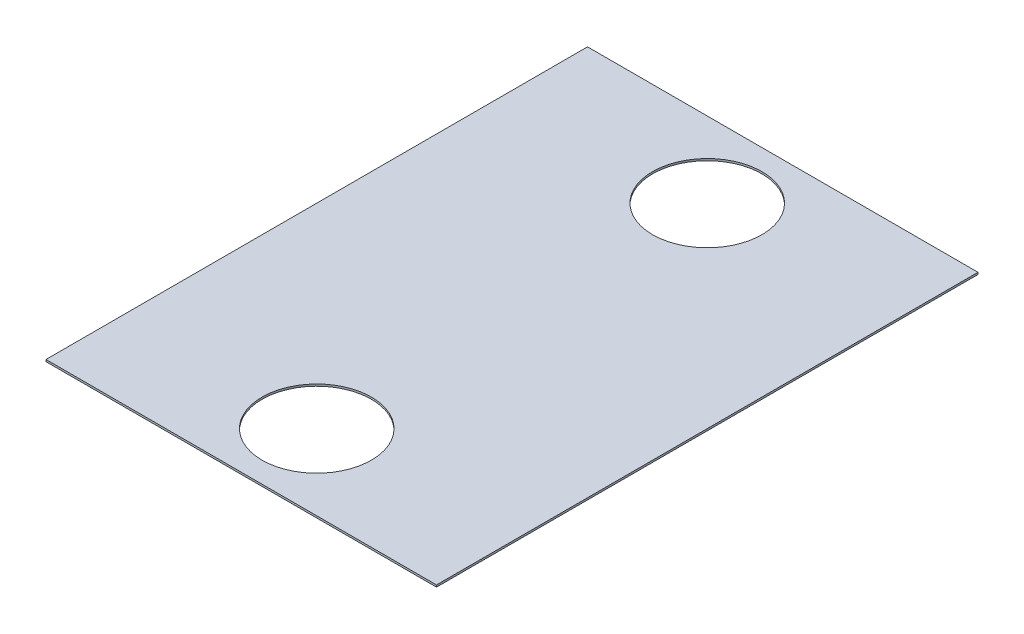
ISO-10303-21;
HEADER;
FILE_DESCRIPTION(('STEP AP214'),'2;1');
FILE_NAME('part.step','',(''),(''),'','','');
FILE_SCHEMA(('AUTOMOTIVE_DESIGN { 1 0 10303 214 1 1 1 1 }'));
ENDSEC;
DATA;
#1=APPLICATION_CONTEXT('core data for automotive mechanical design processes');
#2=APPLICATION_PROTOCOL_DEFINITION('international standard','automotive_design',2000,#1);
#3=PRODUCT_CONTEXT('',#1,'mechanical');
#4=PRODUCT('Part','Part','',(#3));
#5=PRODUCT_RELATED_PRODUCT_CATEGORY('part','',(#4));
#6=PRODUCT_DEFINITION_FORMATION('','',#4);
#7=PRODUCT_DEFINITION_CONTEXT('part definition',#1,'design');
#8=PRODUCT_DEFINITION('design','',#6,#7);
#9=PRODUCT_DEFINITION_SHAPE('','',#8);
#10=(LENGTH_UNIT() NAMED_UNIT(*) SI_UNIT(.MILLI.,.METRE.));
#11=(NAMED_UNIT(*) PLANE_ANGLE_UNIT() SI_UNIT($,.RADIAN.));
#12=(NAMED_UNIT(*) SI_UNIT($,.STERADIAN.) SOLID_ANGLE_UNIT());
#13=UNCERTAINTY_MEASURE_WITH_UNIT(LENGTH_MEASURE(1.E-05),#10,'distance_accuracy_value','');
#14=(GEOMETRIC_REPRESENTATION_CONTEXT(3) GLOBAL_UNCERTAINTY_ASSIGNED_CONTEXT((#13)) GLOBAL_UNIT_ASSIGNED_CONTEXT((#10,
#11,#12)) REPRESENTATION_CONTEXT('',''));
#15=CARTESIAN_POINT('',(0.,0.,0.));
#16=DIRECTION('',(0.,0.,1.));
#17=DIRECTION('',(1.,0.,0.));
#18=AXIS2_PLACEMENT_3D('',#15,#16,#17);
#19=CARTESIAN_POINT('',(-150.,1.5,-208.));
#20=DIRECTION('',(1.,0.,0.));
#21=DIRECTION('',(0.,0.,-1.));
#22=AXIS2_PLACEMENT_3D('',#19,#20,#21);
#23=PLANE('',#22);
#24=DIRECTION('',(0.,0.,1.));
#25=VECTOR('',#24,1.);
#26=CARTESIAN_POINT('',(-150.,0.,-208.));
#27=LINE('',#26,#25);
#28=CARTESIAN_POINT('',(-150.,0.,-208.));
#29=VERTEX_POINT('',#28);
#30=CARTESIAN_POINT('',(-150.,0.,208.));
#31=VERTEX_POINT('',#30);
#32=EDGE_CURVE('E106',#29,#31,#27,.T.);
#33=ORIENTED_EDGE('',*,*,#32,.T.);
#34=DIRECTION('',(0.,-1.,0.));
#35=VECTOR('',#34,1.);
#36=CARTESIAN_POINT('',(-150.,1.5,208.));
#37=LINE('',#36,#35);
#38=CARTESIAN_POINT('',(-150.,1.5,208.));
#39=VERTEX_POINT('',#38);
#40=EDGE_CURVE('E11',#39,#31,#37,.T.);
#41=ORIENTED_EDGE('',*,*,#40,.F.);
#42=DIRECTION('',(0.,0.,1.));
#43=VECTOR('',#42,1.);
#44=CARTESIAN_POINT('',(-150.,1.5,-208.));
#45=LINE('',#44,#43);
#46=CARTESIAN_POINT('',(-150.,1.5,-208.));
#47=VERTEX_POINT('',#46);
#48=EDGE_CURVE('E94',#47,#39,#45,.T.);
#49=ORIENTED_EDGE('',*,*,#48,.F.);
#50=DIRECTION('',(0.,-1.,0.));
#51=VECTOR('',#50,1.);
#52=CARTESIAN_POINT('',(-150.,1.5,-208.));
#53=LINE('',#52,#51);
#54=EDGE_CURVE('E105',#47,#29,#53,.T.);
#55=ORIENTED_EDGE('',*,*,#54,.T.);
#56=EDGE_LOOP('',(#33,#41,#49,#55));
#57=FACE_BOUND('',#56,.T.);
#58=ADVANCED_FACE('F43',(#57),#23,.F.);
#59=CARTESIAN_POINT('',(-150.,1.5,208.));
#60=DIRECTION('',(0.,0.,-1.));
#61=DIRECTION('',(-1.,0.,0.));
#62=AXIS2_PLACEMENT_3D('',#59,#60,#61);
#63=PLANE('',#62);
#64=DIRECTION('',(1.,0.,0.));
#65=VECTOR('',#64,1.);
#66=CARTESIAN_POINT('',(-150.,0.,208.));
#67=LINE('',#66,#65);
#68=CARTESIAN_POINT('',(150.,0.,208.));
#69=VERTEX_POINT('',#68);
#70=EDGE_CURVE('E98',#31,#69,#67,.T.);
#71=ORIENTED_EDGE('',*,*,#70,.T.);
#72=DIRECTION('',(0.,-1.,0.));
#73=VECTOR('',#72,1.);
#74=CARTESIAN_POINT('',(150.,1.5,208.));
#75=LINE('',#74,#73);
#76=CARTESIAN_POINT('',(150.,1.5,208.));
#77=VERTEX_POINT('',#76);
#78=EDGE_CURVE('E51',#77,#69,#75,.T.);
#79=ORIENTED_EDGE('',*,*,#78,.F.);
#80=DIRECTION('',(1.,0.,0.));
#81=VECTOR('',#80,1.);
#82=CARTESIAN_POINT('',(-150.,1.5,208.));
#83=LINE('',#82,#81);
#84=EDGE_CURVE('E90',#39,#77,#83,.T.);
#85=ORIENTED_EDGE('',*,*,#84,.F.);
#86=ORIENTED_EDGE('',*,*,#40,.T.);
#87=EDGE_LOOP('',(#71,#79,#85,#86));
#88=FACE_BOUND('',#87,.T.);
#89=ADVANCED_FACE('F100',(#88),#63,.F.);
#90=CARTESIAN_POINT('',(150.,1.5,-208.));
#91=DIRECTION('',(-1.,0.,0.));
#92=DIRECTION('',(0.,0.,1.));
#93=AXIS2_PLACEMENT_3D('',#90,#91,#92);
#94=PLANE('',#93);
#95=DIRECTION('',(0.,0.,-1.));
#96=VECTOR('',#95,1.);
#97=CARTESIAN_POINT('',(150.,0.,-208.));
#98=LINE('',#97,#96);
#99=CARTESIAN_POINT('',(150.,0.,-208.));
#100=VERTEX_POINT('',#99);
#101=EDGE_CURVE('E78',#69,#100,#98,.T.);
#102=ORIENTED_EDGE('',*,*,#101,.T.);
#103=DIRECTION('',(0.,-1.,0.));
#104=VECTOR('',#103,1.);
#105=CARTESIAN_POINT('',(150.,1.5,-208.));
#106=LINE('',#105,#104);
#107=CARTESIAN_POINT('',(150.,1.5,-208.));
#108=VERTEX_POINT('',#107);
#109=EDGE_CURVE('E97',#108,#100,#106,.T.);
#110=ORIENTED_EDGE('',*,*,#109,.F.);
#111=DIRECTION('',(0.,0.,-1.));
#112=VECTOR('',#111,1.);
#113=CARTESIAN_POINT('',(150.,1.5,-208.));
#114=LINE('',#113,#112);
#115=EDGE_CURVE('E95',#77,#108,#114,.T.);
#116=ORIENTED_EDGE('',*,*,#115,.F.);
#117=ORIENTED_EDGE('',*,*,#78,.T.);
#118=EDGE_LOOP('',(#102,#110,#116,#117));
#119=FACE_BOUND('',#118,.T.);
#120=ADVANCED_FACE('F99',(#119),#94,.F.);
#121=CARTESIAN_POINT('',(-150.,1.5,-208.));
#122=DIRECTION('',(0.,0.,1.));
#123=DIRECTION('',(1.,0.,0.));
#124=AXIS2_PLACEMENT_3D('',#121,#122,#123);
#125=PLANE('',#124);
#126=DIRECTION('',(-1.,0.,0.));
#127=VECTOR('',#126,1.);
#128=CARTESIAN_POINT('',(-150.,0.,-208.));
#129=LINE('',#128,#127);
#130=EDGE_CURVE('E85',#100,#29,#129,.T.);
#131=ORIENTED_EDGE('',*,*,#130,.T.);
#132=ORIENTED_EDGE('',*,*,#54,.F.);
#133=DIRECTION('',(-1.,0.,0.));
#134=VECTOR('',#133,1.);
#135=CARTESIAN_POINT('',(-150.,1.5,-208.));
#136=LINE('',#135,#134);
#137=EDGE_CURVE('E56',#108,#47,#136,.T.);
#138=ORIENTED_EDGE('',*,*,#137,.F.);
#139=ORIENTED_EDGE('',*,*,#109,.T.);
#140=EDGE_LOOP('',(#131,#132,#138,#139));
#141=FACE_BOUND('',#140,.T.);
#142=ADVANCED_FACE('F111',(#141),#125,.F.);
#143=CARTESIAN_POINT('',(0.,1.5,0.));
#144=DIRECTION('',(0.,1.,0.));
#145=DIRECTION('',(0.,0.,1.));
#146=AXIS2_PLACEMENT_3D('',#143,#144,#145);
#147=PLANE('',#146);
#148=CARTESIAN_POINT('',(0.,1.5,150.));
#149=DIRECTION('',(0.,1.,0.));
#150=DIRECTION('',(0.,0.,1.));
#151=AXIS2_PLACEMENT_3D('',#148,#149,#150);
#152=CIRCLE('',#151,42.);
#153=CARTESIAN_POINT('',(0.,1.5,192.));
#154=VERTEX_POINT('',#153);
#155=EDGE_CURVE('E108',#154,#154,#152,.T.);
#156=ORIENTED_EDGE('',*,*,#155,.F.);
#157=EDGE_LOOP('',(#156));
#158=FACE_BOUND('',#157,.T.);
#159=CARTESIAN_POINT('',(0.,1.5,-150.));
#160=DIRECTION('',(0.,1.,0.));
#161=DIRECTION('',(0.,0.,1.));
#162=AXIS2_PLACEMENT_3D('',#159,#160,#161);
#163=CIRCLE('',#162,42.);
#164=CARTESIAN_POINT('',(0.,1.5,-108.));
#165=VERTEX_POINT('',#164);
#166=EDGE_CURVE('E118',#165,#165,#163,.T.);
#167=ORIENTED_EDGE('',*,*,#166,.F.);
#168=EDGE_LOOP('',(#167));
#169=FACE_BOUND('',#168,.T.);
#170=ORIENTED_EDGE('',*,*,#48,.T.);
#171=ORIENTED_EDGE('',*,*,#84,.T.);
#172=ORIENTED_EDGE('',*,*,#115,.T.);
#173=ORIENTED_EDGE('',*,*,#137,.T.);
#174=EDGE_LOOP('',(#170,#171,#172,#173));
#175=FACE_BOUND('',#174,.T.);
#176=ADVANCED_FACE('F89',(#158,#169,#175),#147,.T.);
#177=CARTESIAN_POINT('',(0.,0.,0.));
#178=DIRECTION('',(0.,1.,0.));
#179=DIRECTION('',(0.,0.,1.));
#180=AXIS2_PLACEMENT_3D('',#177,#178,#179);
#181=PLANE('',#180);
#182=CARTESIAN_POINT('',(0.,0.,150.));
#183=DIRECTION('',(0.,1.,0.));
#184=DIRECTION('',(0.,0.,1.));
#185=AXIS2_PLACEMENT_3D('',#182,#183,#184);
#186=CIRCLE('',#185,42.);
#187=CARTESIAN_POINT('',(0.,0.,192.));
#188=VERTEX_POINT('',#187);
#189=EDGE_CURVE('E127',#188,#188,#186,.T.);
#190=ORIENTED_EDGE('',*,*,#189,.T.);
#191=EDGE_LOOP('',(#190));
#192=FACE_BOUND('',#191,.T.);
#193=CARTESIAN_POINT('',(0.,0.,-150.));
#194=DIRECTION('',(0.,1.,0.));
#195=DIRECTION('',(0.,0.,1.));
#196=AXIS2_PLACEMENT_3D('',#193,#194,#195);
#197=CIRCLE('',#196,42.);
#198=CARTESIAN_POINT('',(0.,0.,-108.));
#199=VERTEX_POINT('',#198);
#200=EDGE_CURVE('E124',#199,#199,#197,.T.);
#201=ORIENTED_EDGE('',*,*,#200,.T.);
#202=EDGE_LOOP('',(#201));
#203=FACE_BOUND('',#202,.T.);
#204=ORIENTED_EDGE('',*,*,#32,.F.);
#205=ORIENTED_EDGE('',*,*,#130,.F.);
#206=ORIENTED_EDGE('',*,*,#101,.F.);
#207=ORIENTED_EDGE('',*,*,#70,.F.);
#208=EDGE_LOOP('',(#204,#205,#206,#207));
#209=FACE_BOUND('',#208,.T.);
#210=ADVANCED_FACE('F119',(#192,#203,#209),#181,.F.);
#211=CARTESIAN_POINT('',(0.,1.5,-150.));
#212=DIRECTION('',(0.,-1.,0.));
#213=DIRECTION('',(0.,0.,-1.));
#214=AXIS2_PLACEMENT_3D('',#211,#212,#213);
#215=CYLINDRICAL_SURFACE('',#214,42.);
#216=ORIENTED_EDGE('',*,*,#166,.T.);
#217=EDGE_LOOP('',(#216));
#218=FACE_BOUND('',#217,.T.);
#219=ORIENTED_EDGE('',*,*,#200,.F.);
#220=EDGE_LOOP('',(#219));
#221=FACE_BOUND('',#220,.T.);
#222=ADVANCED_FACE('F136',(#218,#221),#215,.F.);
#223=CARTESIAN_POINT('',(0.,1.5,150.));
#224=DIRECTION('',(0.,-1.,0.));
#225=DIRECTION('',(0.,0.,-1.));
#226=AXIS2_PLACEMENT_3D('',#223,#224,#225);
#227=CYLINDRICAL_SURFACE('',#226,42.);
#228=ORIENTED_EDGE('',*,*,#155,.T.);
#229=EDGE_LOOP('',(#228));
#230=FACE_BOUND('',#229,.T.);
#231=ORIENTED_EDGE('',*,*,#189,.F.);
#232=EDGE_LOOP('',(#231));
#233=FACE_BOUND('',#232,.T.);
#234=ADVANCED_FACE('F135',(#230,#233),#227,.F.);
#235=CLOSED_SHELL('',(#58,#89,#120,#142,#176,#210,#222,#234));
#236=MANIFOLD_SOLID_BREP('B2',#235);
#237=ADVANCED_BREP_SHAPE_REPRESENTATION('',(#18,#236),#14);
#238=SHAPE_DEFINITION_REPRESENTATION(#9,#237);
ENDSEC;
END-ISO-10303-21;
